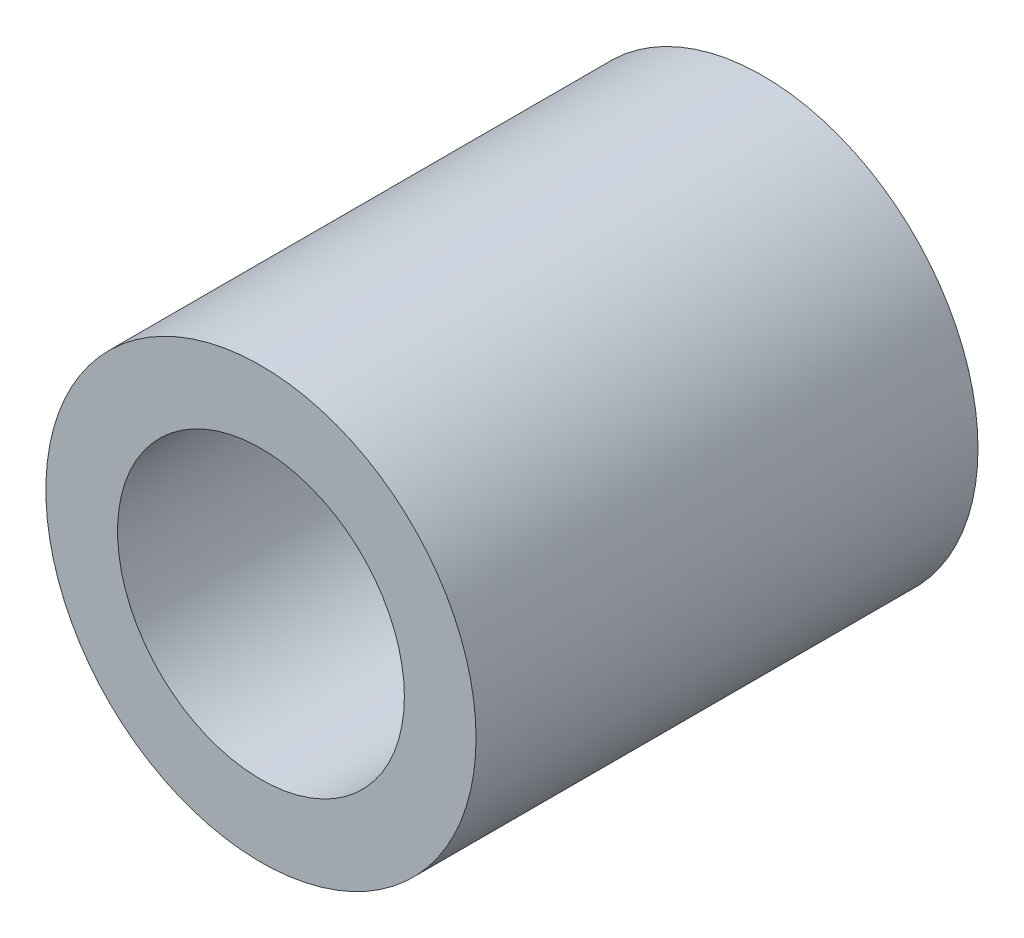
ISO-10303-21;
HEADER;
FILE_DESCRIPTION(('STEP AP214'),'2;1');
FILE_NAME('part.step','',(''),(''),'','','');
FILE_SCHEMA(('AUTOMOTIVE_DESIGN { 1 0 10303 214 1 1 1 1 }'));
ENDSEC;
DATA;
#1=APPLICATION_CONTEXT('core data for automotive mechanical design processes');
#2=APPLICATION_PROTOCOL_DEFINITION('international standard','automotive_design',2000,#1);
#3=PRODUCT_CONTEXT('',#1,'mechanical');
#4=PRODUCT('Part','Part','',(#3));
#5=PRODUCT_RELATED_PRODUCT_CATEGORY('part','',(#4));
#6=PRODUCT_DEFINITION_FORMATION('','',#4);
#7=PRODUCT_DEFINITION_CONTEXT('part definition',#1,'design');
#8=PRODUCT_DEFINITION('design','',#6,#7);
#9=PRODUCT_DEFINITION_SHAPE('','',#8);
#10=(LENGTH_UNIT() NAMED_UNIT(*) SI_UNIT(.MILLI.,.METRE.));
#11=(NAMED_UNIT(*) PLANE_ANGLE_UNIT() SI_UNIT($,.RADIAN.));
#12=(NAMED_UNIT(*) SI_UNIT($,.STERADIAN.) SOLID_ANGLE_UNIT());
#13=UNCERTAINTY_MEASURE_WITH_UNIT(LENGTH_MEASURE(1.E-05),#10,'distance_accuracy_value','');
#14=(GEOMETRIC_REPRESENTATION_CONTEXT(3) GLOBAL_UNCERTAINTY_ASSIGNED_CONTEXT((#13)) GLOBAL_UNIT_ASSIGNED_CONTEXT((#10,
#11,#12)) REPRESENTATION_CONTEXT('',''));
#15=CARTESIAN_POINT('',(0.,0.,0.));
#16=DIRECTION('',(0.,0.,1.));
#17=DIRECTION('',(1.,0.,0.));
#18=AXIS2_PLACEMENT_3D('',#15,#16,#17);
#19=CARTESIAN_POINT('',(0.,0.,7.));
#20=DIRECTION('',(0.,0.,1.));
#21=DIRECTION('',(1.,0.,0.));
#22=AXIS2_PLACEMENT_3D('',#19,#20,#21);
#23=PLANE('',#22);
#24=CARTESIAN_POINT('',(0.,0.,7.));
#25=DIRECTION('',(0.,0.,1.));
#26=DIRECTION('',(1.,0.,0.));
#27=AXIS2_PLACEMENT_3D('',#24,#25,#26);
#28=CIRCLE('',#27,3.);
#29=CARTESIAN_POINT('',(3.,0.,7.));
#30=VERTEX_POINT('',#29);
#31=EDGE_CURVE('E10',#30,#30,#28,.T.);
#32=ORIENTED_EDGE('',*,*,#31,.T.);
#33=EDGE_LOOP('',(#32));
#34=FACE_BOUND('',#33,.T.);
#35=CARTESIAN_POINT('',(0.,0.,7.));
#36=DIRECTION('',(0.,0.,1.));
#37=DIRECTION('',(1.,0.,0.));
#38=AXIS2_PLACEMENT_3D('',#35,#36,#37);
#39=CIRCLE('',#38,2.);
#40=CARTESIAN_POINT('',(2.,0.,7.));
#41=VERTEX_POINT('',#40);
#42=EDGE_CURVE('E42',#41,#41,#39,.T.);
#43=ORIENTED_EDGE('',*,*,#42,.F.);
#44=EDGE_LOOP('',(#43));
#45=FACE_BOUND('',#44,.T.);
#46=ADVANCED_FACE('F31',(#34,#45),#23,.T.);
#47=CARTESIAN_POINT('',(0.,0.,0.));
#48=DIRECTION('',(0.,0.,1.));
#49=DIRECTION('',(1.,0.,0.));
#50=AXIS2_PLACEMENT_3D('',#47,#48,#49);
#51=PLANE('',#50);
#52=CARTESIAN_POINT('',(0.,0.,0.));
#53=DIRECTION('',(0.,0.,1.));
#54=DIRECTION('',(1.,0.,0.));
#55=AXIS2_PLACEMENT_3D('',#52,#53,#54);
#56=CIRCLE('',#55,3.);
#57=CARTESIAN_POINT('',(3.,0.,0.));
#58=VERTEX_POINT('',#57);
#59=EDGE_CURVE('E35',#58,#58,#56,.T.);
#60=ORIENTED_EDGE('',*,*,#59,.F.);
#61=EDGE_LOOP('',(#60));
#62=FACE_BOUND('',#61,.T.);
#63=CARTESIAN_POINT('',(0.,0.,0.));
#64=DIRECTION('',(0.,0.,1.));
#65=DIRECTION('',(1.,0.,0.));
#66=AXIS2_PLACEMENT_3D('',#63,#64,#65);
#67=CIRCLE('',#66,2.);
#68=CARTESIAN_POINT('',(2.,0.,0.));
#69=VERTEX_POINT('',#68);
#70=EDGE_CURVE('E44',#69,#69,#67,.T.);
#71=ORIENTED_EDGE('',*,*,#70,.T.);
#72=EDGE_LOOP('',(#71));
#73=FACE_BOUND('',#72,.T.);
#74=ADVANCED_FACE('F54',(#62,#73),#51,.F.);
#75=CARTESIAN_POINT('',(0.,0.,7.));
#76=DIRECTION('',(0.,0.,-1.));
#77=DIRECTION('',(-1.,0.,0.));
#78=AXIS2_PLACEMENT_3D('',#75,#76,#77);
#79=CYLINDRICAL_SURFACE('',#78,3.);
#80=ORIENTED_EDGE('',*,*,#31,.F.);
#81=EDGE_LOOP('',(#80));
#82=FACE_BOUND('',#81,.T.);
#83=ORIENTED_EDGE('',*,*,#59,.T.);
#84=EDGE_LOOP('',(#83));
#85=FACE_BOUND('',#84,.T.);
#86=ADVANCED_FACE('F33',(#82,#85),#79,.T.);
#87=CARTESIAN_POINT('',(0.,0.,7.));
#88=DIRECTION('',(0.,0.,-1.));
#89=DIRECTION('',(-1.,0.,0.));
#90=AXIS2_PLACEMENT_3D('',#87,#88,#89);
#91=CYLINDRICAL_SURFACE('',#90,2.);
#92=ORIENTED_EDGE('',*,*,#42,.T.);
#93=EDGE_LOOP('',(#92));
#94=FACE_BOUND('',#93,.T.);
#95=ORIENTED_EDGE('',*,*,#70,.F.);
#96=EDGE_LOOP('',(#95));
#97=FACE_BOUND('',#96,.T.);
#98=ADVANCED_FACE('F50',(#94,#97),#91,.F.);
#99=CLOSED_SHELL('',(#46,#74,#86,#98));
#100=MANIFOLD_SOLID_BREP('B2',#99);
#101=ADVANCED_BREP_SHAPE_REPRESENTATION('',(#18,#100),#14);
#102=SHAPE_DEFINITION_REPRESENTATION(#9,#101);
ENDSEC;
END-ISO-10303-21;
